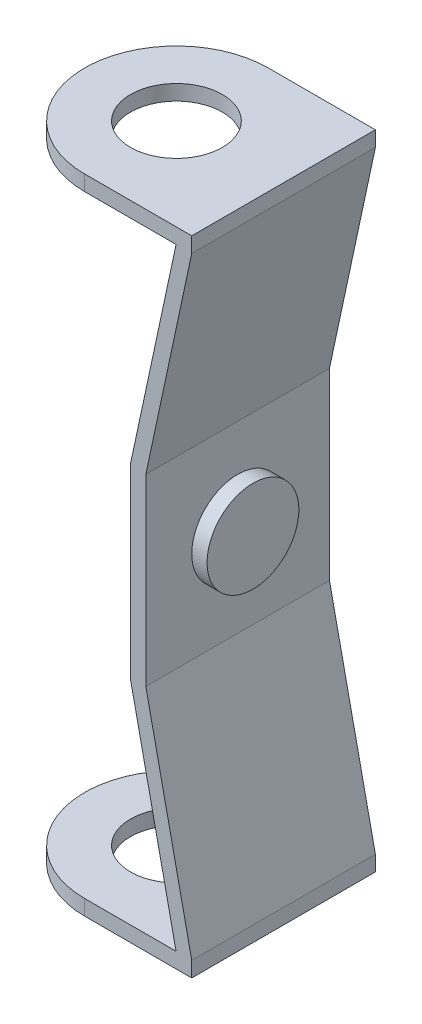
ISO-10303-21;
HEADER;
FILE_DESCRIPTION(('STEP AP214'),'2;1');
FILE_NAME('part.step','',(''),(''),'','','');
FILE_SCHEMA(('AUTOMOTIVE_DESIGN { 1 0 10303 214 1 1 1 1 }'));
ENDSEC;
DATA;
#1=APPLICATION_CONTEXT('core data for automotive mechanical design processes');
#2=APPLICATION_PROTOCOL_DEFINITION('international standard','automotive_design',2000,#1);
#3=PRODUCT_CONTEXT('',#1,'mechanical');
#4=PRODUCT('Part','Part','',(#3));
#5=PRODUCT_RELATED_PRODUCT_CATEGORY('part','',(#4));
#6=PRODUCT_DEFINITION_FORMATION('','',#4);
#7=PRODUCT_DEFINITION_CONTEXT('part definition',#1,'design');
#8=PRODUCT_DEFINITION('design','',#6,#7);
#9=PRODUCT_DEFINITION_SHAPE('','',#8);
#10=(LENGTH_UNIT() NAMED_UNIT(*) SI_UNIT(.MILLI.,.METRE.));
#11=(NAMED_UNIT(*) PLANE_ANGLE_UNIT() SI_UNIT($,.RADIAN.));
#12=(NAMED_UNIT(*) SI_UNIT($,.STERADIAN.) SOLID_ANGLE_UNIT());
#13=UNCERTAINTY_MEASURE_WITH_UNIT(LENGTH_MEASURE(1.E-05),#10,'distance_accuracy_value','');
#14=(GEOMETRIC_REPRESENTATION_CONTEXT(3) GLOBAL_UNCERTAINTY_ASSIGNED_CONTEXT((#13)) GLOBAL_UNIT_ASSIGNED_CONTEXT((#10,
#11,#12)) REPRESENTATION_CONTEXT('',''));
#15=CARTESIAN_POINT('',(0.,0.,0.));
#16=DIRECTION('',(0.,0.,1.));
#17=DIRECTION('',(1.,0.,0.));
#18=AXIS2_PLACEMENT_3D('',#15,#16,#17);
#19=CARTESIAN_POINT('',(0.,0.,-30.));
#20=DIRECTION('',(0.,0.,1.));
#21=DIRECTION('',(1.,0.,0.));
#22=AXIS2_PLACEMENT_3D('',#19,#20,#21);
#23=PLANE('',#22);
#24=DIRECTION('',(0.,1.,0.));
#25=VECTOR('',#24,1.);
#26=CARTESIAN_POINT('',(-20.,-105.,-30.));
#27=LINE('',#26,#25);
#28=CARTESIAN_POINT('',(-20.,105.,-30.));
#29=VERTEX_POINT('',#28);
#30=CARTESIAN_POINT('',(-20.,100.,-30.));
#31=VERTEX_POINT('',#30);
#32=EDGE_CURVE('E223',#29,#31,#27,.F.);
#33=ORIENTED_EDGE('',*,*,#32,.F.);
#34=DIRECTION('',(-1.,0.,0.));
#35=VECTOR('',#34,1.);
#36=CARTESIAN_POINT('',(15.,105.,-30.));
#37=LINE('',#36,#35);
#38=CARTESIAN_POINT('',(15.,105.,-30.));
#39=VERTEX_POINT('',#38);
#40=EDGE_CURVE('E173',#39,#29,#37,.T.);
#41=ORIENTED_EDGE('',*,*,#40,.F.);
#42=DIRECTION('',(0.,1.,0.));
#43=VECTOR('',#42,1.);
#44=CARTESIAN_POINT('',(15.,100.,-30.));
#45=LINE('',#44,#43);
#46=CARTESIAN_POINT('',(15.,100.,-30.));
#47=VERTEX_POINT('',#46);
#48=EDGE_CURVE('E170',#47,#39,#45,.T.);
#49=ORIENTED_EDGE('',*,*,#48,.F.);
#50=DIRECTION('',(0.209529088730874,0.977802414077409,0.));
#51=VECTOR('',#50,1.);
#52=CARTESIAN_POINT('',(0.,30.,-30.));
#53=LINE('',#52,#51);
#54=CARTESIAN_POINT('',(0.,30.,-30.));
#55=VERTEX_POINT('',#54);
#56=EDGE_CURVE('E167',#55,#47,#53,.T.);
#57=ORIENTED_EDGE('',*,*,#56,.F.);
#58=DIRECTION('',(0.,1.,0.));
#59=VECTOR('',#58,1.);
#60=CARTESIAN_POINT('',(0.,-30.,-30.));
#61=LINE('',#60,#59);
#62=CARTESIAN_POINT('',(0.,-30.,-30.));
#63=VERTEX_POINT('',#62);
#64=EDGE_CURVE('E195',#63,#55,#61,.T.);
#65=ORIENTED_EDGE('',*,*,#64,.F.);
#66=DIRECTION('',(-0.209529088730874,0.977802414077409,0.));
#67=VECTOR('',#66,1.);
#68=CARTESIAN_POINT('',(0.,-30.,-30.));
#69=LINE('',#68,#67);
#70=CARTESIAN_POINT('',(15.,-100.,-30.));
#71=VERTEX_POINT('',#70);
#72=EDGE_CURVE('E193',#71,#63,#69,.T.);
#73=ORIENTED_EDGE('',*,*,#72,.F.);
#74=DIRECTION('',(0.,1.,0.));
#75=VECTOR('',#74,1.);
#76=CARTESIAN_POINT('',(15.,-100.,-30.));
#77=LINE('',#76,#75);
#78=CARTESIAN_POINT('',(15.,-105.,-30.));
#79=VERTEX_POINT('',#78);
#80=EDGE_CURVE('E191',#79,#71,#77,.T.);
#81=ORIENTED_EDGE('',*,*,#80,.F.);
#82=DIRECTION('',(1.,0.,0.));
#83=VECTOR('',#82,1.);
#84=CARTESIAN_POINT('',(15.,-105.,-30.));
#85=LINE('',#84,#83);
#86=CARTESIAN_POINT('',(-20.,-105.,-30.));
#87=VERTEX_POINT('',#86);
#88=EDGE_CURVE('E189',#87,#79,#85,.T.);
#89=ORIENTED_EDGE('',*,*,#88,.F.);
#90=DIRECTION('',(0.,1.,0.));
#91=VECTOR('',#90,1.);
#92=CARTESIAN_POINT('',(-20.,-105.,-30.));
#93=LINE('',#92,#91);
#94=CARTESIAN_POINT('',(-20.,-100.,-30.));
#95=VERTEX_POINT('',#94);
#96=EDGE_CURVE('E138',#87,#95,#93,.T.);
#97=ORIENTED_EDGE('',*,*,#96,.T.);
#98=DIRECTION('',(-1.,0.,0.));
#99=VECTOR('',#98,1.);
#100=CARTESIAN_POINT('',(-50.,-100.,-30.));
#101=LINE('',#100,#99);
#102=CARTESIAN_POINT('',(9.88649247740131,-100.,-30.));
#103=VERTEX_POINT('',#102);
#104=EDGE_CURVE('E186',#103,#95,#101,.T.);
#105=ORIENTED_EDGE('',*,*,#104,.F.);
#106=DIRECTION('',(0.209529088730873,-0.97780241407741,0.));
#107=VECTOR('',#106,1.);
#108=CARTESIAN_POINT('',(9.88649247740131,-100.,-30.));
#109=LINE('',#108,#107);
#110=CARTESIAN_POINT('',(-5.,-30.5297017721272,-30.));
#111=VERTEX_POINT('',#110);
#112=EDGE_CURVE('E184',#111,#103,#109,.T.);
#113=ORIENTED_EDGE('',*,*,#112,.F.);
#114=DIRECTION('',(0.,-1.,0.));
#115=VECTOR('',#114,1.);
#116=CARTESIAN_POINT('',(-5.,30.5297017721272,-30.));
#117=LINE('',#116,#115);
#118=CARTESIAN_POINT('',(-5.,30.5297017721272,-30.));
#119=VERTEX_POINT('',#118);
#120=EDGE_CURVE('E181',#119,#111,#117,.T.);
#121=ORIENTED_EDGE('',*,*,#120,.F.);
#122=DIRECTION('',(-0.209529088730873,-0.97780241407741,0.));
#123=VECTOR('',#122,1.);
#124=CARTESIAN_POINT('',(9.88649247740131,100.,-30.));
#125=LINE('',#124,#123);
#126=CARTESIAN_POINT('',(9.88649247740131,100.,-30.));
#127=VERTEX_POINT('',#126);
#128=EDGE_CURVE('E178',#127,#119,#125,.T.);
#129=ORIENTED_EDGE('',*,*,#128,.F.);
#130=DIRECTION('',(1.,0.,0.));
#131=VECTOR('',#130,1.);
#132=CARTESIAN_POINT('',(-50.,100.,-30.));
#133=LINE('',#132,#131);
#134=EDGE_CURVE('E176',#31,#127,#133,.T.);
#135=ORIENTED_EDGE('',*,*,#134,.F.);
#136=EDGE_LOOP('',(#33,#41,#49,#57,#65,#73,#81,#89,#97,#105,#113,#121,#129,#135));
#137=FACE_BOUND('',#136,.T.);
#138=ADVANCED_FACE('F34',(#137),#23,.F.);
#139=CARTESIAN_POINT('',(0.,30.,30.));
#140=DIRECTION('',(-0.977802414077409,0.209529088730874,0.));
#141=DIRECTION('',(-0.209529088730874,-0.97780241407741,0.));
#142=AXIS2_PLACEMENT_3D('',#139,#140,#141);
#143=PLANE('',#142);
#144=ORIENTED_EDGE('',*,*,#56,.T.);
#145=DIRECTION('',(0.,0.,-1.));
#146=VECTOR('',#145,1.);
#147=CARTESIAN_POINT('',(15.,100.,30.));
#148=LINE('',#147,#146);
#149=CARTESIAN_POINT('',(15.,100.,30.));
#150=VERTEX_POINT('',#149);
#151=EDGE_CURVE('E220',#150,#47,#148,.T.);
#152=ORIENTED_EDGE('',*,*,#151,.F.);
#153=DIRECTION('',(0.209529088730874,0.977802414077409,0.));
#154=VECTOR('',#153,1.);
#155=CARTESIAN_POINT('',(0.,30.,30.));
#156=LINE('',#155,#154);
#157=CARTESIAN_POINT('',(0.,30.,30.));
#158=VERTEX_POINT('',#157);
#159=EDGE_CURVE('E197',#158,#150,#156,.T.);
#160=ORIENTED_EDGE('',*,*,#159,.F.);
#161=DIRECTION('',(0.,0.,-1.));
#162=VECTOR('',#161,1.);
#163=CARTESIAN_POINT('',(0.,30.,30.));
#164=LINE('',#163,#162);
#165=EDGE_CURVE('E166',#158,#55,#164,.T.);
#166=ORIENTED_EDGE('',*,*,#165,.T.);
#167=EDGE_LOOP('',(#144,#152,#160,#166));
#168=FACE_BOUND('',#167,.T.);
#169=ADVANCED_FACE('F297',(#168),#143,.F.);
#170=CARTESIAN_POINT('',(15.,100.,30.));
#171=DIRECTION('',(-1.,0.,0.));
#172=DIRECTION('',(0.,0.,1.));
#173=AXIS2_PLACEMENT_3D('',#170,#171,#172);
#174=PLANE('',#173);
#175=ORIENTED_EDGE('',*,*,#48,.T.);
#176=DIRECTION('',(0.,0.,-1.));
#177=VECTOR('',#176,1.);
#178=CARTESIAN_POINT('',(15.,105.,30.));
#179=LINE('',#178,#177);
#180=CARTESIAN_POINT('',(15.,105.,30.));
#181=VERTEX_POINT('',#180);
#182=EDGE_CURVE('E217',#181,#39,#179,.T.);
#183=ORIENTED_EDGE('',*,*,#182,.F.);
#184=DIRECTION('',(0.,1.,0.));
#185=VECTOR('',#184,1.);
#186=CARTESIAN_POINT('',(15.,100.,30.));
#187=LINE('',#186,#185);
#188=EDGE_CURVE('E257',#150,#181,#187,.T.);
#189=ORIENTED_EDGE('',*,*,#188,.F.);
#190=ORIENTED_EDGE('',*,*,#151,.T.);
#191=EDGE_LOOP('',(#175,#183,#189,#190));
#192=FACE_BOUND('',#191,.T.);
#193=ADVANCED_FACE('F302',(#192),#174,.F.);
#194=CARTESIAN_POINT('',(15.,105.,30.));
#195=DIRECTION('',(0.,-1.,0.));
#196=DIRECTION('',(1.,0.,0.));
#197=AXIS2_PLACEMENT_3D('',#194,#195,#196);
#198=PLANE('',#197);
#199=CARTESIAN_POINT('',(-20.,105.,0.));
#200=DIRECTION('',(0.,1.,0.));
#201=DIRECTION('',(-1.,0.,0.));
#202=AXIS2_PLACEMENT_3D('',#199,#200,#201);
#203=CIRCLE('',#202,15.);
#204=CARTESIAN_POINT('',(-35.,105.,0.));
#205=VERTEX_POINT('',#204);
#206=EDGE_CURVE('E239',#205,#205,#203,.T.);
#207=ORIENTED_EDGE('',*,*,#206,.F.);
#208=EDGE_LOOP('',(#207));
#209=FACE_BOUND('',#208,.T.);
#210=ORIENTED_EDGE('',*,*,#40,.T.);
#211=CARTESIAN_POINT('',(-20.,105.,0.));
#212=DIRECTION('',(0.,-1.,0.));
#213=DIRECTION('',(-1.,0.,0.));
#214=AXIS2_PLACEMENT_3D('',#211,#212,#213);
#215=CIRCLE('',#214,30.);
#216=CARTESIAN_POINT('',(-20.,105.,30.));
#217=VERTEX_POINT('',#216);
#218=EDGE_CURVE('E49',#217,#29,#215,.T.);
#219=ORIENTED_EDGE('',*,*,#218,.F.);
#220=DIRECTION('',(-1.,0.,0.));
#221=VECTOR('',#220,1.);
#222=CARTESIAN_POINT('',(15.,105.,30.));
#223=LINE('',#222,#221);
#224=EDGE_CURVE('E259',#181,#217,#223,.T.);
#225=ORIENTED_EDGE('',*,*,#224,.F.);
#226=ORIENTED_EDGE('',*,*,#182,.T.);
#227=EDGE_LOOP('',(#210,#219,#225,#226));
#228=FACE_BOUND('',#227,.T.);
#229=ADVANCED_FACE('F305',(#209,#228),#198,.F.);
#230=CARTESIAN_POINT('',(-50.,100.,30.));
#231=DIRECTION('',(0.,1.,0.));
#232=DIRECTION('',(0.,0.,1.));
#233=AXIS2_PLACEMENT_3D('',#230,#231,#232);
#234=PLANE('',#233);
#235=CARTESIAN_POINT('',(-20.,100.,0.));
#236=DIRECTION('',(0.,1.,0.));
#237=DIRECTION('',(0.,0.,1.));
#238=AXIS2_PLACEMENT_3D('',#235,#236,#237);
#239=CIRCLE('',#238,15.);
#240=CARTESIAN_POINT('',(-20.,100.,15.));
#241=VERTEX_POINT('',#240);
#242=EDGE_CURVE('E171',#241,#241,#239,.T.);
#243=ORIENTED_EDGE('',*,*,#242,.T.);
#244=EDGE_LOOP('',(#243));
#245=FACE_BOUND('',#244,.T.);
#246=DIRECTION('',(1.,0.,0.));
#247=VECTOR('',#246,1.);
#248=CARTESIAN_POINT('',(-50.,100.,30.));
#249=LINE('',#248,#247);
#250=CARTESIAN_POINT('',(-20.,100.,30.));
#251=VERTEX_POINT('',#250);
#252=CARTESIAN_POINT('',(9.88649247740131,100.,30.));
#253=VERTEX_POINT('',#252);
#254=EDGE_CURVE('E262',#251,#253,#249,.T.);
#255=ORIENTED_EDGE('',*,*,#254,.F.);
#256=CARTESIAN_POINT('',(-20.,100.,0.));
#257=DIRECTION('',(0.,1.,0.));
#258=DIRECTION('',(0.,0.,1.));
#259=AXIS2_PLACEMENT_3D('',#256,#257,#258);
#260=CIRCLE('',#259,30.);
#261=EDGE_CURVE('E247',#251,#31,#260,.F.);
#262=ORIENTED_EDGE('',*,*,#261,.T.);
#263=ORIENTED_EDGE('',*,*,#134,.T.);
#264=DIRECTION('',(0.,0.,-1.));
#265=VECTOR('',#264,1.);
#266=CARTESIAN_POINT('',(9.88649247740131,100.,30.));
#267=LINE('',#266,#265);
#268=EDGE_CURVE('E214',#253,#127,#267,.T.);
#269=ORIENTED_EDGE('',*,*,#268,.F.);
#270=EDGE_LOOP('',(#255,#262,#263,#269));
#271=FACE_BOUND('',#270,.T.);
#272=ADVANCED_FACE('F310',(#245,#271),#234,.F.);
#273=CARTESIAN_POINT('',(9.88649247740131,100.,30.));
#274=DIRECTION('',(0.97780241407741,-0.209529088730873,0.));
#275=DIRECTION('',(0.209529088730873,0.97780241407741,0.));
#276=AXIS2_PLACEMENT_3D('',#273,#274,#275);
#277=PLANE('',#276);
#278=ORIENTED_EDGE('',*,*,#128,.T.);
#279=DIRECTION('',(0.,0.,-1.));
#280=VECTOR('',#279,1.);
#281=CARTESIAN_POINT('',(-5.,30.5297017721272,30.));
#282=LINE('',#281,#280);
#283=CARTESIAN_POINT('',(-5.,30.5297017721272,30.));
#284=VERTEX_POINT('',#283);
#285=EDGE_CURVE('E212',#284,#119,#282,.T.);
#286=ORIENTED_EDGE('',*,*,#285,.F.);
#287=DIRECTION('',(-0.209529088730873,-0.97780241407741,0.));
#288=VECTOR('',#287,1.);
#289=CARTESIAN_POINT('',(9.88649247740131,100.,30.));
#290=LINE('',#289,#288);
#291=EDGE_CURVE('E264',#253,#284,#290,.T.);
#292=ORIENTED_EDGE('',*,*,#291,.F.);
#293=ORIENTED_EDGE('',*,*,#268,.T.);
#294=EDGE_LOOP('',(#278,#286,#292,#293));
#295=FACE_BOUND('',#294,.T.);
#296=ADVANCED_FACE('F316',(#295),#277,.F.);
#297=CARTESIAN_POINT('',(-5.,30.5297017721272,30.));
#298=DIRECTION('',(1.,0.,0.));
#299=DIRECTION('',(0.,0.,-1.));
#300=AXIS2_PLACEMENT_3D('',#297,#298,#299);
#301=PLANE('',#300);
#302=CARTESIAN_POINT('',(-5.,0.,0.));
#303=DIRECTION('',(1.,0.,0.));
#304=DIRECTION('',(0.,0.,-1.));
#305=AXIS2_PLACEMENT_3D('',#302,#303,#304);
#306=CIRCLE('',#305,15.);
#307=CARTESIAN_POINT('',(-5.,0.,-15.));
#308=VERTEX_POINT('',#307);
#309=EDGE_CURVE('E227',#308,#308,#306,.F.);
#310=ORIENTED_EDGE('',*,*,#309,.F.);
#311=EDGE_LOOP('',(#310));
#312=FACE_BOUND('',#311,.T.);
#313=ORIENTED_EDGE('',*,*,#120,.T.);
#314=DIRECTION('',(0.,0.,-1.));
#315=VECTOR('',#314,1.);
#316=CARTESIAN_POINT('',(-5.,-30.5297017721272,30.));
#317=LINE('',#316,#315);
#318=CARTESIAN_POINT('',(-5.,-30.5297017721272,30.));
#319=VERTEX_POINT('',#318);
#320=EDGE_CURVE('E210',#319,#111,#317,.T.);
#321=ORIENTED_EDGE('',*,*,#320,.F.);
#322=DIRECTION('',(0.,-1.,0.));
#323=VECTOR('',#322,1.);
#324=CARTESIAN_POINT('',(-5.,30.5297017721272,30.));
#325=LINE('',#324,#323);
#326=EDGE_CURVE('E266',#284,#319,#325,.T.);
#327=ORIENTED_EDGE('',*,*,#326,.F.);
#328=ORIENTED_EDGE('',*,*,#285,.T.);
#329=EDGE_LOOP('',(#313,#321,#327,#328));
#330=FACE_BOUND('',#329,.T.);
#331=ADVANCED_FACE('F318',(#312,#330),#301,.F.);
#332=CARTESIAN_POINT('',(9.88649247740131,-100.,30.));
#333=DIRECTION('',(0.97780241407741,0.209529088730873,0.));
#334=DIRECTION('',(-0.209529088730873,0.97780241407741,0.));
#335=AXIS2_PLACEMENT_3D('',#332,#333,#334);
#336=PLANE('',#335);
#337=ORIENTED_EDGE('',*,*,#112,.T.);
#338=DIRECTION('',(0.,0.,-1.));
#339=VECTOR('',#338,1.);
#340=CARTESIAN_POINT('',(9.88649247740131,-100.,30.));
#341=LINE('',#340,#339);
#342=CARTESIAN_POINT('',(9.88649247740131,-100.,30.));
#343=VERTEX_POINT('',#342);
#344=EDGE_CURVE('E207',#343,#103,#341,.T.);
#345=ORIENTED_EDGE('',*,*,#344,.F.);
#346=DIRECTION('',(0.209529088730873,-0.97780241407741,0.));
#347=VECTOR('',#346,1.);
#348=CARTESIAN_POINT('',(9.88649247740131,-100.,30.));
#349=LINE('',#348,#347);
#350=EDGE_CURVE('E159',#319,#343,#349,.T.);
#351=ORIENTED_EDGE('',*,*,#350,.F.);
#352=ORIENTED_EDGE('',*,*,#320,.T.);
#353=EDGE_LOOP('',(#337,#345,#351,#352));
#354=FACE_BOUND('',#353,.T.);
#355=ADVANCED_FACE('F272',(#354),#336,.F.);
#356=CARTESIAN_POINT('',(-50.,-100.,30.));
#357=DIRECTION('',(0.,-1.,0.));
#358=DIRECTION('',(0.,0.,-1.));
#359=AXIS2_PLACEMENT_3D('',#356,#357,#358);
#360=PLANE('',#359);
#361=CARTESIAN_POINT('',(-20.,-100.,0.));
#362=DIRECTION('',(0.,-1.,0.));
#363=DIRECTION('',(0.,0.,-1.));
#364=AXIS2_PLACEMENT_3D('',#361,#362,#363);
#365=CIRCLE('',#364,15.);
#366=CARTESIAN_POINT('',(-20.,-100.,-15.));
#367=VERTEX_POINT('',#366);
#368=EDGE_CURVE('E250',#367,#367,#365,.T.);
#369=ORIENTED_EDGE('',*,*,#368,.T.);
#370=EDGE_LOOP('',(#369));
#371=FACE_BOUND('',#370,.T.);
#372=ORIENTED_EDGE('',*,*,#104,.T.);
#373=CARTESIAN_POINT('',(-20.,-100.,0.));
#374=DIRECTION('',(0.,-1.,0.));
#375=DIRECTION('',(0.,0.,-1.));
#376=AXIS2_PLACEMENT_3D('',#373,#374,#375);
#377=CIRCLE('',#376,30.);
#378=CARTESIAN_POINT('',(-20.,-100.,30.));
#379=VERTEX_POINT('',#378);
#380=EDGE_CURVE('E57',#95,#379,#377,.F.);
#381=ORIENTED_EDGE('',*,*,#380,.T.);
#382=DIRECTION('',(-1.,0.,0.));
#383=VECTOR('',#382,1.);
#384=CARTESIAN_POINT('',(-50.,-100.,30.));
#385=LINE('',#384,#383);
#386=EDGE_CURVE('E149',#343,#379,#385,.T.);
#387=ORIENTED_EDGE('',*,*,#386,.F.);
#388=ORIENTED_EDGE('',*,*,#344,.T.);
#389=EDGE_LOOP('',(#372,#381,#387,#388));
#390=FACE_BOUND('',#389,.T.);
#391=ADVANCED_FACE('F276',(#371,#390),#360,.F.);
#392=CARTESIAN_POINT('',(15.,-105.,30.));
#393=DIRECTION('',(0.,1.,0.));
#394=DIRECTION('',(-1.,0.,0.));
#395=AXIS2_PLACEMENT_3D('',#392,#393,#394);
#396=PLANE('',#395);
#397=CARTESIAN_POINT('',(-20.,-105.,0.));
#398=DIRECTION('',(0.,1.,0.));
#399=DIRECTION('',(-1.,0.,0.));
#400=AXIS2_PLACEMENT_3D('',#397,#398,#399);
#401=CIRCLE('',#400,15.);
#402=CARTESIAN_POINT('',(-35.,-105.,0.));
#403=VERTEX_POINT('',#402);
#404=EDGE_CURVE('E241',#403,#403,#401,.T.);
#405=ORIENTED_EDGE('',*,*,#404,.T.);
#406=EDGE_LOOP('',(#405));
#407=FACE_BOUND('',#406,.T.);
#408=DIRECTION('',(1.,0.,0.));
#409=VECTOR('',#408,1.);
#410=CARTESIAN_POINT('',(15.,-105.,30.));
#411=LINE('',#410,#409);
#412=CARTESIAN_POINT('',(-20.,-105.,30.));
#413=VERTEX_POINT('',#412);
#414=CARTESIAN_POINT('',(15.,-105.,30.));
#415=VERTEX_POINT('',#414);
#416=EDGE_CURVE('E146',#413,#415,#411,.T.);
#417=ORIENTED_EDGE('',*,*,#416,.F.);
#418=CARTESIAN_POINT('',(-20.,-105.,0.));
#419=DIRECTION('',(0.,-1.,0.));
#420=DIRECTION('',(-1.,0.,0.));
#421=AXIS2_PLACEMENT_3D('',#418,#419,#420);
#422=CIRCLE('',#421,30.);
#423=EDGE_CURVE('E133',#413,#87,#422,.T.);
#424=ORIENTED_EDGE('',*,*,#423,.T.);
#425=ORIENTED_EDGE('',*,*,#88,.T.);
#426=DIRECTION('',(0.,0.,-1.));
#427=VECTOR('',#426,1.);
#428=CARTESIAN_POINT('',(15.,-105.,30.));
#429=LINE('',#428,#427);
#430=EDGE_CURVE('E153',#415,#79,#429,.T.);
#431=ORIENTED_EDGE('',*,*,#430,.F.);
#432=EDGE_LOOP('',(#417,#424,#425,#431));
#433=FACE_BOUND('',#432,.T.);
#434=ADVANCED_FACE('F151',(#407,#433),#396,.F.);
#435=CARTESIAN_POINT('',(15.,-100.,30.));
#436=DIRECTION('',(-1.,0.,0.));
#437=DIRECTION('',(0.,0.,1.));
#438=AXIS2_PLACEMENT_3D('',#435,#436,#437);
#439=PLANE('',#438);
#440=ORIENTED_EDGE('',*,*,#80,.T.);
#441=DIRECTION('',(0.,0.,-1.));
#442=VECTOR('',#441,1.);
#443=CARTESIAN_POINT('',(15.,-100.,30.));
#444=LINE('',#443,#442);
#445=CARTESIAN_POINT('',(15.,-100.,30.));
#446=VERTEX_POINT('',#445);
#447=EDGE_CURVE('E203',#446,#71,#444,.T.);
#448=ORIENTED_EDGE('',*,*,#447,.F.);
#449=DIRECTION('',(0.,1.,0.));
#450=VECTOR('',#449,1.);
#451=CARTESIAN_POINT('',(15.,-100.,30.));
#452=LINE('',#451,#450);
#453=EDGE_CURVE('E155',#415,#446,#452,.T.);
#454=ORIENTED_EDGE('',*,*,#453,.F.);
#455=ORIENTED_EDGE('',*,*,#430,.T.);
#456=EDGE_LOOP('',(#440,#448,#454,#455));
#457=FACE_BOUND('',#456,.T.);
#458=ADVANCED_FACE('F282',(#457),#439,.F.);
#459=CARTESIAN_POINT('',(0.,-30.,30.));
#460=DIRECTION('',(-0.977802414077409,-0.209529088730874,0.));
#461=DIRECTION('',(0.209529088730874,-0.97780241407741,0.));
#462=AXIS2_PLACEMENT_3D('',#459,#460,#461);
#463=PLANE('',#462);
#464=ORIENTED_EDGE('',*,*,#72,.T.);
#465=DIRECTION('',(0.,0.,-1.));
#466=VECTOR('',#465,1.);
#467=CARTESIAN_POINT('',(0.,-30.,30.));
#468=LINE('',#467,#466);
#469=CARTESIAN_POINT('',(0.,-30.,30.));
#470=VERTEX_POINT('',#469);
#471=EDGE_CURVE('E200',#470,#63,#468,.T.);
#472=ORIENTED_EDGE('',*,*,#471,.F.);
#473=DIRECTION('',(-0.209529088730874,0.977802414077409,0.));
#474=VECTOR('',#473,1.);
#475=CARTESIAN_POINT('',(0.,-30.,30.));
#476=LINE('',#475,#474);
#477=EDGE_CURVE('E157',#446,#470,#476,.T.);
#478=ORIENTED_EDGE('',*,*,#477,.F.);
#479=ORIENTED_EDGE('',*,*,#447,.T.);
#480=EDGE_LOOP('',(#464,#472,#478,#479));
#481=FACE_BOUND('',#480,.T.);
#482=ADVANCED_FACE('F289',(#481),#463,.F.);
#483=CARTESIAN_POINT('',(0.,-30.,30.));
#484=DIRECTION('',(-1.,0.,0.));
#485=DIRECTION('',(0.,0.,1.));
#486=AXIS2_PLACEMENT_3D('',#483,#484,#485);
#487=PLANE('',#486);
#488=CARTESIAN_POINT('',(0.,0.,0.));
#489=DIRECTION('',(-1.,0.,0.));
#490=DIRECTION('',(0.,0.,1.));
#491=AXIS2_PLACEMENT_3D('',#488,#489,#490);
#492=CIRCLE('',#491,15.);
#493=CARTESIAN_POINT('',(0.,0.,15.));
#494=VERTEX_POINT('',#493);
#495=EDGE_CURVE('E225',#494,#494,#492,.F.);
#496=ORIENTED_EDGE('',*,*,#495,.F.);
#497=EDGE_LOOP('',(#496));
#498=FACE_BOUND('',#497,.T.);
#499=ORIENTED_EDGE('',*,*,#64,.T.);
#500=ORIENTED_EDGE('',*,*,#165,.F.);
#501=DIRECTION('',(0.,1.,0.));
#502=VECTOR('',#501,1.);
#503=CARTESIAN_POINT('',(0.,-30.,30.));
#504=LINE('',#503,#502);
#505=EDGE_CURVE('E164',#470,#158,#504,.T.);
#506=ORIENTED_EDGE('',*,*,#505,.F.);
#507=ORIENTED_EDGE('',*,*,#471,.T.);
#508=EDGE_LOOP('',(#499,#500,#506,#507));
#509=FACE_BOUND('',#508,.T.);
#510=ADVANCED_FACE('F292',(#498,#509),#487,.F.);
#511=CARTESIAN_POINT('',(0.,0.,30.));
#512=DIRECTION('',(0.,0.,1.));
#513=DIRECTION('',(1.,0.,0.));
#514=AXIS2_PLACEMENT_3D('',#511,#512,#513);
#515=PLANE('',#514);
#516=DIRECTION('',(0.,1.,0.));
#517=VECTOR('',#516,1.);
#518=CARTESIAN_POINT('',(-20.,-105.,30.));
#519=LINE('',#518,#517);
#520=EDGE_CURVE('E136',#413,#379,#519,.T.);
#521=ORIENTED_EDGE('',*,*,#520,.F.);
#522=ORIENTED_EDGE('',*,*,#416,.T.);
#523=ORIENTED_EDGE('',*,*,#453,.T.);
#524=ORIENTED_EDGE('',*,*,#477,.T.);
#525=ORIENTED_EDGE('',*,*,#505,.T.);
#526=ORIENTED_EDGE('',*,*,#159,.T.);
#527=ORIENTED_EDGE('',*,*,#188,.T.);
#528=ORIENTED_EDGE('',*,*,#224,.T.);
#529=EDGE_CURVE('E142',#251,#217,#519,.T.);
#530=ORIENTED_EDGE('',*,*,#529,.F.);
#531=ORIENTED_EDGE('',*,*,#254,.T.);
#532=ORIENTED_EDGE('',*,*,#291,.T.);
#533=ORIENTED_EDGE('',*,*,#326,.T.);
#534=ORIENTED_EDGE('',*,*,#350,.T.);
#535=ORIENTED_EDGE('',*,*,#386,.T.);
#536=EDGE_LOOP('',(#521,#522,#523,#524,#525,#526,#527,#528,#530,#531,#532,#533,#534,#535));
#537=FACE_BOUND('',#536,.T.);
#538=ADVANCED_FACE('F145',(#537),#515,.T.);
#539=CARTESIAN_POINT('',(-20.,-105.,0.));
#540=DIRECTION('',(0.,1.,0.));
#541=DIRECTION('',(-1.,0.,0.));
#542=AXIS2_PLACEMENT_3D('',#539,#540,#541);
#543=CYLINDRICAL_SURFACE('',#542,30.);
#544=ORIENTED_EDGE('',*,*,#96,.F.);
#545=ORIENTED_EDGE('',*,*,#423,.F.);
#546=ORIENTED_EDGE('',*,*,#520,.T.);
#547=ORIENTED_EDGE('',*,*,#380,.F.);
#548=EDGE_LOOP('',(#544,#545,#546,#547));
#549=FACE_BOUND('',#548,.T.);
#550=ADVANCED_FACE('F135',(#549),#543,.T.);
#551=ORIENTED_EDGE('',*,*,#218,.T.);
#552=ORIENTED_EDGE('',*,*,#32,.T.);
#553=ORIENTED_EDGE('',*,*,#261,.F.);
#554=ORIENTED_EDGE('',*,*,#529,.T.);
#555=EDGE_LOOP('',(#551,#552,#553,#554));
#556=FACE_BOUND('',#555,.T.);
#557=ADVANCED_FACE('F306',(#556),#543,.T.);
#558=CARTESIAN_POINT('',(-20.,-105.,0.));
#559=DIRECTION('',(0.,1.,0.));
#560=DIRECTION('',(-1.,0.,0.));
#561=AXIS2_PLACEMENT_3D('',#558,#559,#560);
#562=CYLINDRICAL_SURFACE('',#561,15.);
#563=ORIENTED_EDGE('',*,*,#404,.F.);
#564=EDGE_LOOP('',(#563));
#565=FACE_BOUND('',#564,.T.);
#566=ORIENTED_EDGE('',*,*,#368,.F.);
#567=EDGE_LOOP('',(#566));
#568=FACE_BOUND('',#567,.T.);
#569=ADVANCED_FACE('F352',(#565,#568),#562,.F.);
#570=ORIENTED_EDGE('',*,*,#206,.T.);
#571=EDGE_LOOP('',(#570));
#572=FACE_BOUND('',#571,.T.);
#573=ORIENTED_EDGE('',*,*,#242,.F.);
#574=EDGE_LOOP('',(#573));
#575=FACE_BOUND('',#574,.T.);
#576=ADVANCED_FACE('F354',(#572,#575),#562,.F.);
#577=CARTESIAN_POINT('',(5.,0.,0.));
#578=DIRECTION('',(-1.,0.,0.));
#579=DIRECTION('',(0.,0.,1.));
#580=AXIS2_PLACEMENT_3D('',#577,#578,#579);
#581=PLANE('',#580);
#582=CARTESIAN_POINT('',(5.,0.,0.));
#583=DIRECTION('',(-1.,0.,0.));
#584=DIRECTION('',(0.,0.,1.));
#585=AXIS2_PLACEMENT_3D('',#582,#583,#584);
#586=CIRCLE('',#585,15.);
#587=CARTESIAN_POINT('',(5.,0.,15.));
#588=VERTEX_POINT('',#587);
#589=EDGE_CURVE('E236',#588,#588,#586,.T.);
#590=ORIENTED_EDGE('',*,*,#589,.F.);
#591=EDGE_LOOP('',(#590));
#592=FACE_BOUND('',#591,.T.);
#593=ADVANCED_FACE('F360',(#592),#581,.F.);
#594=CARTESIAN_POINT('',(-15.,0.,0.));
#595=DIRECTION('',(1.,0.,0.));
#596=DIRECTION('',(0.,0.,-1.));
#597=AXIS2_PLACEMENT_3D('',#594,#595,#596);
#598=CYLINDRICAL_SURFACE('',#597,15.);
#599=ORIENTED_EDGE('',*,*,#589,.T.);
#600=EDGE_LOOP('',(#599));
#601=FACE_BOUND('',#600,.T.);
#602=ORIENTED_EDGE('',*,*,#495,.T.);
#603=EDGE_LOOP('',(#602));
#604=FACE_BOUND('',#603,.T.);
#605=ADVANCED_FACE('F369',(#601,#604),#598,.T.);
#606=CARTESIAN_POINT('',(-11.,0.,0.));
#607=DIRECTION('',(-1.,0.,0.));
#608=DIRECTION('',(0.,0.,1.));
#609=AXIS2_PLACEMENT_3D('',#606,#607,#608);
#610=CIRCLE('',#609,15.);
#611=CARTESIAN_POINT('',(-11.,0.,15.));
#612=VERTEX_POINT('',#611);
#613=EDGE_CURVE('E11',#612,#612,#610,.F.);
#614=ORIENTED_EDGE('',*,*,#613,.T.);
#615=EDGE_LOOP('',(#614));
#616=FACE_BOUND('',#615,.T.);
#617=ORIENTED_EDGE('',*,*,#309,.T.);
#618=EDGE_LOOP('',(#617));
#619=FACE_BOUND('',#618,.T.);
#620=ADVANCED_FACE('F365',(#616,#619),#598,.T.);
#621=CARTESIAN_POINT('',(-15.,0.,0.));
#622=DIRECTION('',(-1.,0.,0.));
#623=DIRECTION('',(0.,0.,1.));
#624=AXIS2_PLACEMENT_3D('',#621,#622,#623);
#625=PLANE('',#624);
#626=CARTESIAN_POINT('',(-15.,0.,0.));
#627=DIRECTION('',(-1.,0.,0.));
#628=DIRECTION('',(0.,0.,1.));
#629=AXIS2_PLACEMENT_3D('',#626,#627,#628);
#630=CIRCLE('',#629,11.);
#631=CARTESIAN_POINT('',(-15.,0.,11.));
#632=VERTEX_POINT('',#631);
#633=EDGE_CURVE('E42',#632,#632,#630,.T.);
#634=ORIENTED_EDGE('',*,*,#633,.T.);
#635=EDGE_LOOP('',(#634));
#636=FACE_BOUND('',#635,.T.);
#637=ADVANCED_FACE('F368',(#636),#625,.T.);
#638=CARTESIAN_POINT('',(-11.,0.,0.));
#639=DIRECTION('',(-1.,0.,0.));
#640=DIRECTION('',(0.,0.,1.));
#641=AXIS2_PLACEMENT_3D('',#638,#639,#640);
#642=TOROIDAL_SURFACE('',#641,11.,4.);
#643=ORIENTED_EDGE('',*,*,#613,.F.);
#644=EDGE_LOOP('',(#643));
#645=FACE_BOUND('',#644,.T.);
#646=ORIENTED_EDGE('',*,*,#633,.F.);
#647=EDGE_LOOP('',(#646));
#648=FACE_BOUND('',#647,.T.);
#649=ADVANCED_FACE('F36',(#645,#648),#642,.T.);
#650=CLOSED_SHELL('',(#138,#169,#193,#229,#272,#296,#331,#355,#391,#434,#458,#482,#510,#538,
#550,#557,#569,#576,#593,#605,#620,#637,#649));
#651=MANIFOLD_SOLID_BREP('B2',#650);
#652=ADVANCED_BREP_SHAPE_REPRESENTATION('',(#18,#651),#14);
#653=SHAPE_DEFINITION_REPRESENTATION(#9,#652);
ENDSEC;
END-ISO-10303-21;
